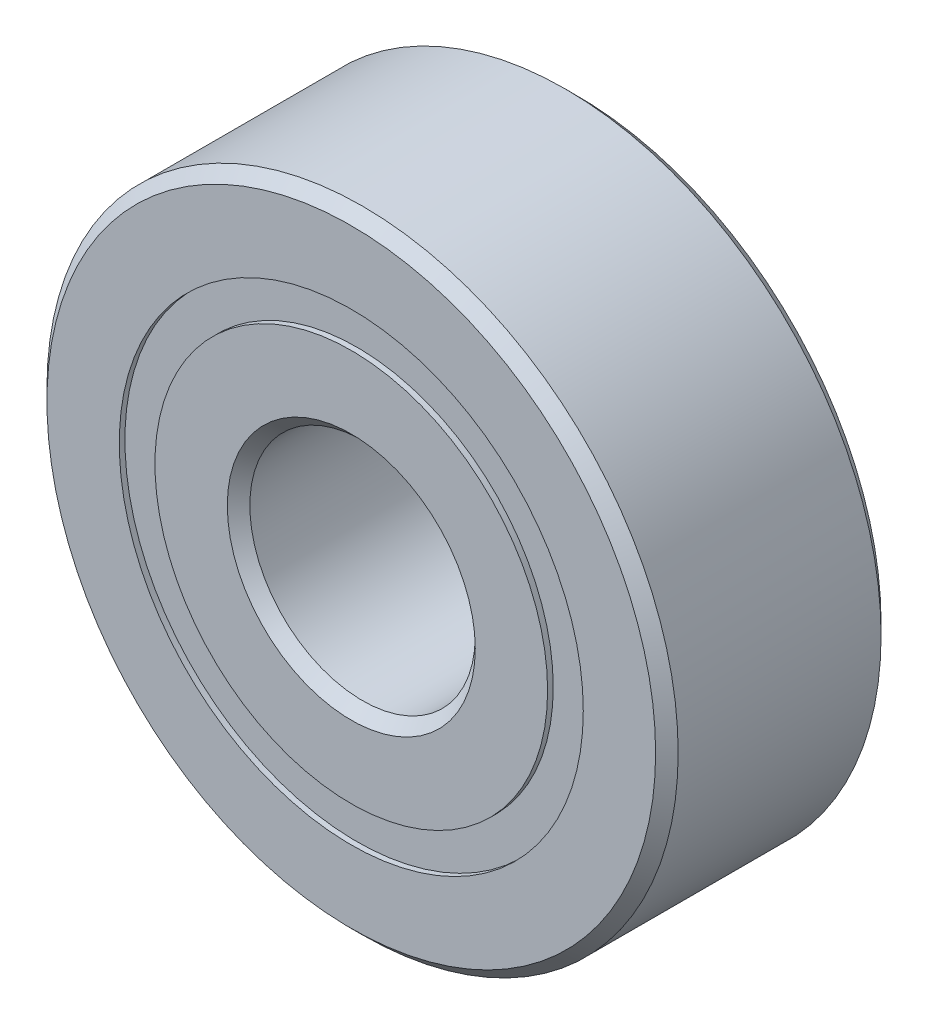
ISO-10303-21;
HEADER;
FILE_DESCRIPTION(('STEP AP214'),'2;1');
FILE_NAME('part.step','',(''),(''),'','','');
FILE_SCHEMA(('AUTOMOTIVE_DESIGN { 1 0 10303 214 1 1 1 1 }'));
ENDSEC;
DATA;
#1=APPLICATION_CONTEXT('core data for automotive mechanical design processes');
#2=APPLICATION_PROTOCOL_DEFINITION('international standard','automotive_design',2000,#1);
#3=PRODUCT_CONTEXT('',#1,'mechanical');
#4=PRODUCT('Part','Part','',(#3));
#5=PRODUCT_RELATED_PRODUCT_CATEGORY('part','',(#4));
#6=PRODUCT_DEFINITION_FORMATION('','',#4);
#7=PRODUCT_DEFINITION_CONTEXT('part definition',#1,'design');
#8=PRODUCT_DEFINITION('design','',#6,#7);
#9=PRODUCT_DEFINITION_SHAPE('','',#8);
#10=(LENGTH_UNIT() NAMED_UNIT(*) SI_UNIT(.MILLI.,.METRE.));
#11=(NAMED_UNIT(*) PLANE_ANGLE_UNIT() SI_UNIT($,.RADIAN.));
#12=(NAMED_UNIT(*) SI_UNIT($,.STERADIAN.) SOLID_ANGLE_UNIT());
#13=UNCERTAINTY_MEASURE_WITH_UNIT(LENGTH_MEASURE(1.E-05),#10,'distance_accuracy_value','');
#14=(GEOMETRIC_REPRESENTATION_CONTEXT(3) GLOBAL_UNCERTAINTY_ASSIGNED_CONTEXT((#13)) GLOBAL_UNIT_ASSIGNED_CONTEXT((#10,
#11,#12)) REPRESENTATION_CONTEXT('',''));
#15=CARTESIAN_POINT('',(0.,0.,0.));
#16=DIRECTION('',(0.,0.,1.));
#17=DIRECTION('',(1.,0.,0.));
#18=AXIS2_PLACEMENT_3D('',#15,#16,#17);
#19=CARTESIAN_POINT('',(0.,5.1456043956044,-2.375));
#20=DIRECTION('',(0.,0.,1.));
#21=DIRECTION('',(1.,0.,0.));
#22=AXIS2_PLACEMENT_3D('',#19,#20,#21);
#23=PLANE('',#22);
#24=CARTESIAN_POINT('',(0.,0.,-2.375));
#25=DIRECTION('',(0.,0.,1.));
#26=DIRECTION('',(1.,0.,0.));
#27=AXIS2_PLACEMENT_3D('',#24,#25,#26);
#28=CIRCLE('',#27,5.1456043956044);
#29=CARTESIAN_POINT('',(5.1456043956044,0.,-2.375));
#30=VERTEX_POINT('',#29);
#31=EDGE_CURVE('E59',#30,#30,#28,.T.);
#32=ORIENTED_EDGE('',*,*,#31,.F.);
#33=EDGE_LOOP('',(#32));
#34=FACE_BOUND('',#33,.T.);
#35=CARTESIAN_POINT('',(0.,0.,-2.375));
#36=DIRECTION('',(0.,0.,1.));
#37=DIRECTION('',(1.,0.,0.));
#38=AXIS2_PLACEMENT_3D('',#35,#36,#37);
#39=CIRCLE('',#38,4.3543956043956);
#40=CARTESIAN_POINT('',(4.3543956043956,0.,-2.375));
#41=VERTEX_POINT('',#40);
#42=EDGE_CURVE('E11',#41,#41,#39,.T.);
#43=ORIENTED_EDGE('',*,*,#42,.T.);
#44=EDGE_LOOP('',(#43));
#45=FACE_BOUND('',#44,.T.);
#46=ADVANCED_FACE('F45',(#34,#45),#23,.F.);
#47=CARTESIAN_POINT('',(0.,0.,2.5));
#48=DIRECTION('',(0.,0.,1.));
#49=DIRECTION('',(1.,0.,0.));
#50=AXIS2_PLACEMENT_3D('',#47,#48,#49);
#51=CYLINDRICAL_SURFACE('',#50,4.3543956043956);
#52=ORIENTED_EDGE('',*,*,#42,.F.);
#53=EDGE_LOOP('',(#52));
#54=FACE_BOUND('',#53,.T.);
#55=CARTESIAN_POINT('',(0.,0.,-1.17943661934675));
#56=DIRECTION('',(0.,0.,1.));
#57=DIRECTION('',(1.,0.,0.));
#58=AXIS2_PLACEMENT_3D('',#55,#56,#57);
#59=CIRCLE('',#58,4.3543956043956);
#60=CARTESIAN_POINT('',(4.3543956043956,0.,-1.17943661934675));
#61=VERTEX_POINT('',#60);
#62=EDGE_CURVE('E51',#61,#61,#59,.T.);
#63=ORIENTED_EDGE('',*,*,#62,.T.);
#64=EDGE_LOOP('',(#63));
#65=FACE_BOUND('',#64,.T.);
#66=ADVANCED_FACE('F68',(#54,#65),#51,.F.);
#67=CARTESIAN_POINT('',(0.,5.1456043956044,-1.17943661934675));
#68=DIRECTION('',(0.,0.,-1.));
#69=DIRECTION('',(-1.,0.,0.));
#70=AXIS2_PLACEMENT_3D('',#67,#68,#69);
#71=PLANE('',#70);
#72=ORIENTED_EDGE('',*,*,#62,.F.);
#73=EDGE_LOOP('',(#72));
#74=FACE_BOUND('',#73,.T.);
#75=CARTESIAN_POINT('',(0.,0.,-1.17943661934675));
#76=DIRECTION('',(0.,0.,1.));
#77=DIRECTION('',(1.,0.,0.));
#78=AXIS2_PLACEMENT_3D('',#75,#76,#77);
#79=CIRCLE('',#78,5.1456043956044);
#80=CARTESIAN_POINT('',(5.1456043956044,0.,-1.17943661934675));
#81=VERTEX_POINT('',#80);
#82=EDGE_CURVE('E55',#81,#81,#79,.T.);
#83=ORIENTED_EDGE('',*,*,#82,.T.);
#84=EDGE_LOOP('',(#83));
#85=FACE_BOUND('',#84,.T.);
#86=ADVANCED_FACE('F72',(#74,#85),#71,.F.);
#87=CARTESIAN_POINT('',(0.,0.,2.5));
#88=DIRECTION('',(0.,0.,1.));
#89=DIRECTION('',(1.,0.,0.));
#90=AXIS2_PLACEMENT_3D('',#87,#88,#89);
#91=CYLINDRICAL_SURFACE('',#90,5.1456043956044);
#92=ORIENTED_EDGE('',*,*,#82,.F.);
#93=EDGE_LOOP('',(#92));
#94=FACE_BOUND('',#93,.T.);
#95=ORIENTED_EDGE('',*,*,#31,.T.);
#96=EDGE_LOOP('',(#95));
#97=FACE_BOUND('',#96,.T.);
#98=ADVANCED_FACE('F65',(#94,#97),#91,.T.);
#99=CLOSED_SHELL('',(#46,#66,#86,#98));
#100=MANIFOLD_SOLID_BREP('B2',#99);
#101=CARTESIAN_POINT('',(0.,5.1456043956044,2.375));
#102=DIRECTION('',(0.,0.,-1.));
#103=DIRECTION('',(-1.,0.,0.));
#104=AXIS2_PLACEMENT_3D('',#101,#102,#103);
#105=PLANE('',#104);
#106=CARTESIAN_POINT('',(0.,0.,2.375));
#107=DIRECTION('',(0.,0.,1.));
#108=DIRECTION('',(1.,0.,0.));
#109=AXIS2_PLACEMENT_3D('',#106,#107,#108);
#110=CIRCLE('',#109,4.3543956043956);
#111=CARTESIAN_POINT('',(4.3543956043956,0.,2.375));
#112=VERTEX_POINT('',#111);
#113=EDGE_CURVE('E44',#112,#112,#110,.T.);
#114=ORIENTED_EDGE('',*,*,#113,.F.);
#115=EDGE_LOOP('',(#114));
#116=FACE_BOUND('',#115,.T.);
#117=CARTESIAN_POINT('',(0.,0.,2.375));
#118=DIRECTION('',(0.,0.,1.));
#119=DIRECTION('',(1.,0.,0.));
#120=AXIS2_PLACEMENT_3D('',#117,#118,#119);
#121=CIRCLE('',#120,5.1456043956044);
#122=CARTESIAN_POINT('',(5.1456043956044,0.,2.375));
#123=VERTEX_POINT('',#122);
#124=EDGE_CURVE('E134',#123,#123,#121,.T.);
#125=ORIENTED_EDGE('',*,*,#124,.T.);
#126=EDGE_LOOP('',(#125));
#127=FACE_BOUND('',#126,.T.);
#128=ADVANCED_FACE('F120',(#116,#127),#105,.F.);
#129=CARTESIAN_POINT('',(0.,0.,2.5));
#130=DIRECTION('',(0.,0.,1.));
#131=DIRECTION('',(1.,0.,0.));
#132=AXIS2_PLACEMENT_3D('',#129,#130,#131);
#133=CYLINDRICAL_SURFACE('',#132,4.3543956043956);
#134=CARTESIAN_POINT('',(0.,0.,1.17943661934675));
#135=DIRECTION('',(0.,0.,1.));
#136=DIRECTION('',(1.,0.,0.));
#137=AXIS2_PLACEMENT_3D('',#134,#135,#136);
#138=CIRCLE('',#137,4.3543956043956);
#139=CARTESIAN_POINT('',(4.3543956043956,0.,1.17943661934675));
#140=VERTEX_POINT('',#139);
#141=EDGE_CURVE('E126',#140,#140,#138,.T.);
#142=ORIENTED_EDGE('',*,*,#141,.F.);
#143=EDGE_LOOP('',(#142));
#144=FACE_BOUND('',#143,.T.);
#145=ORIENTED_EDGE('',*,*,#113,.T.);
#146=EDGE_LOOP('',(#145));
#147=FACE_BOUND('',#146,.T.);
#148=ADVANCED_FACE('F149',(#144,#147),#133,.F.);
#149=CARTESIAN_POINT('',(0.,5.1456043956044,1.17943661934675));
#150=DIRECTION('',(0.,0.,1.));
#151=DIRECTION('',(1.,0.,0.));
#152=AXIS2_PLACEMENT_3D('',#149,#150,#151);
#153=PLANE('',#152);
#154=CARTESIAN_POINT('',(0.,0.,1.17943661934675));
#155=DIRECTION('',(0.,0.,1.));
#156=DIRECTION('',(1.,0.,0.));
#157=AXIS2_PLACEMENT_3D('',#154,#155,#156);
#158=CIRCLE('',#157,5.1456043956044);
#159=CARTESIAN_POINT('',(5.1456043956044,0.,1.17943661934675));
#160=VERTEX_POINT('',#159);
#161=EDGE_CURVE('E130',#160,#160,#158,.T.);
#162=ORIENTED_EDGE('',*,*,#161,.F.);
#163=EDGE_LOOP('',(#162));
#164=FACE_BOUND('',#163,.T.);
#165=ORIENTED_EDGE('',*,*,#141,.T.);
#166=EDGE_LOOP('',(#165));
#167=FACE_BOUND('',#166,.T.);
#168=ADVANCED_FACE('F144',(#164,#167),#153,.F.);
#169=CARTESIAN_POINT('',(0.,0.,2.5));
#170=DIRECTION('',(0.,0.,1.));
#171=DIRECTION('',(1.,0.,0.));
#172=AXIS2_PLACEMENT_3D('',#169,#170,#171);
#173=CYLINDRICAL_SURFACE('',#172,5.1456043956044);
#174=ORIENTED_EDGE('',*,*,#124,.F.);
#175=EDGE_LOOP('',(#174));
#176=FACE_BOUND('',#175,.T.);
#177=ORIENTED_EDGE('',*,*,#161,.T.);
#178=EDGE_LOOP('',(#177));
#179=FACE_BOUND('',#178,.T.);
#180=ADVANCED_FACE('F141',(#176,#179),#173,.T.);
#181=CLOSED_SHELL('',(#128,#148,#168,#180));
#182=MANIFOLD_SOLID_BREP('B6',#181);
#183=CARTESIAN_POINT('',(-2.37499999999995,4.11362066797611,0.));
#184=DIRECTION('',(0.,0.,1.));
#185=DIRECTION('',(-0.499999999999989,0.866025403784445,0.));
#186=AXIS2_PLACEMENT_3D('',#183,#184,#185);
#187=SPHERICAL_SURFACE('',#186,1.17943661934675);
#188=CARTESIAN_POINT('',(-2.37499999999995,4.11362066797611,1.17943661934675));
#189=VERTEX_POINT('',#188);
#190=VERTEX_LOOP('',#189);
#191=FACE_BOUND('',#190,.T.);
#192=ADVANCED_FACE('F195',(#191),#187,.T.);
#193=CLOSED_SHELL('',(#192));
#194=MANIFOLD_SOLID_BREP('B39',#193);
#195=CARTESIAN_POINT('',(-4.11362066797606,2.37500000000005,0.));
#196=DIRECTION('',(0.,0.,1.));
#197=DIRECTION('',(-0.866025403784433,0.50000000000001,0.));
#198=AXIS2_PLACEMENT_3D('',#195,#196,#197);
#199=SPHERICAL_SURFACE('',#198,1.17943661934675);
#200=CARTESIAN_POINT('',(-4.11362066797606,2.37500000000005,1.17943661934675));
#201=VERTEX_POINT('',#200);
#202=VERTEX_LOOP('',#201);
#203=FACE_BOUND('',#202,.T.);
#204=ADVANCED_FACE('F217',(#203),#199,.T.);
#205=CLOSED_SHELL('',(#204));
#206=MANIFOLD_SOLID_BREP('B116',#205);
#207=CARTESIAN_POINT('',(-4.75,0.,0.));
#208=DIRECTION('',(0.,0.,1.));
#209=DIRECTION('',(-1.,0.,0.));
#210=AXIS2_PLACEMENT_3D('',#207,#208,#209);
#211=SPHERICAL_SURFACE('',#210,1.17943661934675);
#212=CARTESIAN_POINT('',(-4.75,0.,1.17943661934675));
#213=VERTEX_POINT('',#212);
#214=VERTEX_LOOP('',#213);
#215=FACE_BOUND('',#214,.T.);
#216=ADVANCED_FACE('F239',(#215),#211,.T.);
#217=CLOSED_SHELL('',(#216));
#218=MANIFOLD_SOLID_BREP('B191',#217);
#219=CARTESIAN_POINT('',(-4.1136206679761,-2.37499999999996,0.));
#220=DIRECTION('',(0.,0.,1.));
#221=DIRECTION('',(-0.866025403784443,-0.499999999999992,0.));
#222=AXIS2_PLACEMENT_3D('',#219,#220,#221);
#223=SPHERICAL_SURFACE('',#222,1.17943661934675);
#224=CARTESIAN_POINT('',(-4.1136206679761,-2.37499999999996,1.17943661934675));
#225=VERTEX_POINT('',#224);
#226=VERTEX_LOOP('',#225);
#227=FACE_BOUND('',#226,.T.);
#228=ADVANCED_FACE('F261',(#227),#223,.T.);
#229=CLOSED_SHELL('',(#228));
#230=MANIFOLD_SOLID_BREP('B213',#229);
#231=CARTESIAN_POINT('',(-2.37500000000003,-4.11362066797606,0.));
#232=DIRECTION('',(0.,0.,1.));
#233=DIRECTION('',(-0.500000000000007,-0.866025403784435,0.));
#234=AXIS2_PLACEMENT_3D('',#231,#232,#233);
#235=SPHERICAL_SURFACE('',#234,1.17943661934675);
#236=CARTESIAN_POINT('',(-2.37500000000003,-4.11362066797606,1.17943661934675));
#237=VERTEX_POINT('',#236);
#238=VERTEX_LOOP('',#237);
#239=FACE_BOUND('',#238,.T.);
#240=ADVANCED_FACE('F283',(#239),#235,.T.);
#241=CLOSED_SHELL('',(#240));
#242=MANIFOLD_SOLID_BREP('B235',#241);
#243=CARTESIAN_POINT('',(0.,-4.75,0.));
#244=DIRECTION('',(0.,0.,1.));
#245=DIRECTION('',(0.,-1.,0.));
#246=AXIS2_PLACEMENT_3D('',#243,#244,#245);
#247=SPHERICAL_SURFACE('',#246,1.17943661934675);
#248=CARTESIAN_POINT('',(0.,-4.75,1.17943661934675));
#249=VERTEX_POINT('',#248);
#250=VERTEX_LOOP('',#249);
#251=FACE_BOUND('',#250,.T.);
#252=ADVANCED_FACE('F305',(#251),#247,.T.);
#253=CLOSED_SHELL('',(#252));
#254=MANIFOLD_SOLID_BREP('B257',#253);
#255=CARTESIAN_POINT('',(2.37499999999998,-4.1136206679761,0.));
#256=DIRECTION('',(0.,0.,1.));
#257=DIRECTION('',(0.499999999999995,-0.866025403784442,0.));
#258=AXIS2_PLACEMENT_3D('',#255,#256,#257);
#259=SPHERICAL_SURFACE('',#258,1.17943661934675);
#260=CARTESIAN_POINT('',(2.37499999999998,-4.1136206679761,1.17943661934675));
#261=VERTEX_POINT('',#260);
#262=VERTEX_LOOP('',#261);
#263=FACE_BOUND('',#262,.T.);
#264=ADVANCED_FACE('F327',(#263),#259,.T.);
#265=CLOSED_SHELL('',(#264));
#266=MANIFOLD_SOLID_BREP('B279',#265);
#267=CARTESIAN_POINT('',(4.11362066797607,-2.37500000000002,0.));
#268=DIRECTION('',(0.,0.,1.));
#269=DIRECTION('',(0.866025403784436,-0.500000000000004,0.));
#270=AXIS2_PLACEMENT_3D('',#267,#268,#269);
#271=SPHERICAL_SURFACE('',#270,1.17943661934675);
#272=CARTESIAN_POINT('',(4.11362066797607,-2.37500000000002,1.17943661934675));
#273=VERTEX_POINT('',#272);
#274=VERTEX_LOOP('',#273);
#275=FACE_BOUND('',#274,.T.);
#276=ADVANCED_FACE('F349',(#275),#271,.T.);
#277=CLOSED_SHELL('',(#276));
#278=MANIFOLD_SOLID_BREP('B301',#277);
#279=CARTESIAN_POINT('',(4.75,0.,0.));
#280=DIRECTION('',(0.,0.,1.));
#281=DIRECTION('',(1.,0.,0.));
#282=AXIS2_PLACEMENT_3D('',#279,#280,#281);
#283=SPHERICAL_SURFACE('',#282,1.17943661934675);
#284=CARTESIAN_POINT('',(4.75,0.,1.17943661934675));
#285=VERTEX_POINT('',#284);
#286=VERTEX_LOOP('',#285);
#287=FACE_BOUND('',#286,.T.);
#288=ADVANCED_FACE('F371',(#287),#283,.T.);
#289=CLOSED_SHELL('',(#288));
#290=MANIFOLD_SOLID_BREP('B323',#289);
#291=CARTESIAN_POINT('',(4.11362066797609,2.37499999999999,0.));
#292=DIRECTION('',(0.,0.,1.));
#293=DIRECTION('',(0.86602540378444,0.499999999999998,0.));
#294=AXIS2_PLACEMENT_3D('',#291,#292,#293);
#295=SPHERICAL_SURFACE('',#294,1.17943661934675);
#296=CARTESIAN_POINT('',(4.11362066797609,2.37499999999999,1.17943661934675));
#297=VERTEX_POINT('',#296);
#298=VERTEX_LOOP('',#297);
#299=FACE_BOUND('',#298,.T.);
#300=ADVANCED_FACE('F393',(#299),#295,.T.);
#301=CLOSED_SHELL('',(#300));
#302=MANIFOLD_SOLID_BREP('B345',#301);
#303=CARTESIAN_POINT('',(2.375,4.11362066797608,0.));
#304=DIRECTION('',(0.,0.,1.));
#305=DIRECTION('',(0.500000000000001,0.866025403784438,0.));
#306=AXIS2_PLACEMENT_3D('',#303,#304,#305);
#307=SPHERICAL_SURFACE('',#306,1.17943661934675);
#308=CARTESIAN_POINT('',(2.375,4.11362066797608,1.17943661934675));
#309=VERTEX_POINT('',#308);
#310=VERTEX_LOOP('',#309);
#311=FACE_BOUND('',#310,.T.);
#312=ADVANCED_FACE('F415',(#311),#307,.T.);
#313=CLOSED_SHELL('',(#312));
#314=MANIFOLD_SOLID_BREP('B367',#313);
#315=CARTESIAN_POINT('',(0.,4.75,0.));
#316=DIRECTION('',(0.,0.,1.));
#317=DIRECTION('',(0.,1.,0.));
#318=AXIS2_PLACEMENT_3D('',#315,#316,#317);
#319=SPHERICAL_SURFACE('',#318,1.17943661934675);
#320=CARTESIAN_POINT('',(0.,4.75,1.17943661934675));
#321=VERTEX_POINT('',#320);
#322=VERTEX_LOOP('',#321);
#323=FACE_BOUND('',#322,.T.);
#324=ADVANCED_FACE('F439',(#323),#319,.T.);
#325=CLOSED_SHELL('',(#324));
#326=MANIFOLD_SOLID_BREP('B389',#325);
#327=CARTESIAN_POINT('',(0.,4.3543956043956,2.5));
#328=DIRECTION('',(0.,0.,-1.));
#329=DIRECTION('',(-1.,0.,0.));
#330=AXIS2_PLACEMENT_3D('',#327,#328,#329);
#331=PLANE('',#330);
#332=CARTESIAN_POINT('',(0.,0.,2.5));
#333=DIRECTION('',(0.,0.,1.));
#334=DIRECTION('',(1.,0.,0.));
#335=AXIS2_PLACEMENT_3D('',#332,#333,#334);
#336=CIRCLE('',#335,2.75);
#337=CARTESIAN_POINT('',(2.75,0.,2.5));
#338=VERTEX_POINT('',#337);
#339=EDGE_CURVE('E488',#338,#338,#336,.T.);
#340=ORIENTED_EDGE('',*,*,#339,.F.);
#341=EDGE_LOOP('',(#340));
#342=FACE_BOUND('',#341,.T.);
#343=CARTESIAN_POINT('',(0.,0.,2.5));
#344=DIRECTION('',(0.,0.,1.));
#345=DIRECTION('',(1.,0.,0.));
#346=AXIS2_PLACEMENT_3D('',#343,#344,#345);
#347=CIRCLE('',#346,4.3543956043956);
#348=CARTESIAN_POINT('',(4.3543956043956,0.,2.5));
#349=VERTEX_POINT('',#348);
#350=EDGE_CURVE('E438',#349,#349,#347,.T.);
#351=ORIENTED_EDGE('',*,*,#350,.T.);
#352=EDGE_LOOP('',(#351));
#353=FACE_BOUND('',#352,.T.);
#354=ADVANCED_FACE('F460',(#342,#353),#331,.F.);
#355=CARTESIAN_POINT('',(0.,0.,2.5));
#356=DIRECTION('',(0.,0.,1.));
#357=DIRECTION('',(1.,0.,0.));
#358=AXIS2_PLACEMENT_3D('',#355,#356,#357);
#359=CYLINDRICAL_SURFACE('',#358,4.3543956043956);
#360=ORIENTED_EDGE('',*,*,#350,.F.);
#361=EDGE_LOOP('',(#360));
#362=FACE_BOUND('',#361,.T.);
#363=CARTESIAN_POINT('',(0.,0.,1.11111111111111));
#364=DIRECTION('',(0.,0.,1.));
#365=DIRECTION('',(1.,0.,0.));
#366=AXIS2_PLACEMENT_3D('',#363,#364,#365);
#367=CIRCLE('',#366,4.3543956043956);
#368=CARTESIAN_POINT('',(4.3543956043956,0.,1.11111111111111));
#369=VERTEX_POINT('',#368);
#370=EDGE_CURVE('E466',#369,#369,#367,.T.);
#371=ORIENTED_EDGE('',*,*,#370,.T.);
#372=EDGE_LOOP('',(#371));
#373=FACE_BOUND('',#372,.T.);
#374=ADVANCED_FACE('F495',(#362,#373),#359,.T.);
#375=CARTESIAN_POINT('',(0.,0.,0.));
#376=DIRECTION('',(0.,0.,1.));
#377=DIRECTION('',(1.,0.,0.));
#378=AXIS2_PLACEMENT_3D('',#375,#376,#377);
#379=TOROIDAL_SURFACE('',#378,4.75,1.17943661934675);
#380=ORIENTED_EDGE('',*,*,#370,.F.);
#381=EDGE_LOOP('',(#380));
#382=FACE_BOUND('',#381,.T.);
#383=CARTESIAN_POINT('',(0.,0.,-1.11111111111111));
#384=DIRECTION('',(0.,0.,1.));
#385=DIRECTION('',(1.,0.,0.));
#386=AXIS2_PLACEMENT_3D('',#383,#384,#385);
#387=CIRCLE('',#386,4.3543956043956);
#388=CARTESIAN_POINT('',(4.3543956043956,0.,-1.11111111111111));
#389=VERTEX_POINT('',#388);
#390=EDGE_CURVE('E470',#389,#389,#387,.T.);
#391=ORIENTED_EDGE('',*,*,#390,.T.);
#392=EDGE_LOOP('',(#391));
#393=FACE_BOUND('',#392,.T.);
#394=ADVANCED_FACE('F499',(#382,#393),#379,.F.);
#395=CARTESIAN_POINT('',(0.,0.,2.5));
#396=DIRECTION('',(0.,0.,1.));
#397=DIRECTION('',(1.,0.,0.));
#398=AXIS2_PLACEMENT_3D('',#395,#396,#397);
#399=CYLINDRICAL_SURFACE('',#398,4.3543956043956);
#400=ORIENTED_EDGE('',*,*,#390,.F.);
#401=EDGE_LOOP('',(#400));
#402=FACE_BOUND('',#401,.T.);
#403=CARTESIAN_POINT('',(0.,0.,-2.5));
#404=DIRECTION('',(0.,0.,1.));
#405=DIRECTION('',(1.,0.,0.));
#406=AXIS2_PLACEMENT_3D('',#403,#404,#405);
#407=CIRCLE('',#406,4.3543956043956);
#408=CARTESIAN_POINT('',(4.3543956043956,0.,-2.5));
#409=VERTEX_POINT('',#408);
#410=EDGE_CURVE('E474',#409,#409,#407,.T.);
#411=ORIENTED_EDGE('',*,*,#410,.T.);
#412=EDGE_LOOP('',(#411));
#413=FACE_BOUND('',#412,.T.);
#414=ADVANCED_FACE('F504',(#402,#413),#399,.T.);
#415=CARTESIAN_POINT('',(0.,2.75,-2.5));
#416=DIRECTION('',(0.,0.,1.));
#417=DIRECTION('',(1.,0.,0.));
#418=AXIS2_PLACEMENT_3D('',#415,#416,#417);
#419=PLANE('',#418);
#420=ORIENTED_EDGE('',*,*,#410,.F.);
#421=EDGE_LOOP('',(#420));
#422=FACE_BOUND('',#421,.T.);
#423=CARTESIAN_POINT('',(0.,0.,-2.5));
#424=DIRECTION('',(0.,0.,1.));
#425=DIRECTION('',(1.,0.,0.));
#426=AXIS2_PLACEMENT_3D('',#423,#424,#425);
#427=CIRCLE('',#426,2.75);
#428=CARTESIAN_POINT('',(2.75,0.,-2.5));
#429=VERTEX_POINT('',#428);
#430=EDGE_CURVE('E479',#429,#429,#427,.T.);
#431=ORIENTED_EDGE('',*,*,#430,.T.);
#432=EDGE_LOOP('',(#431));
#433=FACE_BOUND('',#432,.T.);
#434=ADVANCED_FACE('F510',(#422,#433),#419,.F.);
#435=CARTESIAN_POINT('',(0.,0.,-2.25));
#436=DIRECTION('',(0.,0.,-1.));
#437=DIRECTION('',(-1.,0.,0.));
#438=AXIS2_PLACEMENT_3D('',#435,#436,#437);
#439=CONICAL_SURFACE('',#438,2.5,0.785398163397443);
#440=ORIENTED_EDGE('',*,*,#430,.F.);
#441=EDGE_LOOP('',(#440));
#442=FACE_BOUND('',#441,.T.);
#443=CARTESIAN_POINT('',(0.,0.,-2.25));
#444=DIRECTION('',(0.,0.,1.));
#445=DIRECTION('',(1.,0.,0.));
#446=AXIS2_PLACEMENT_3D('',#443,#444,#445);
#447=CIRCLE('',#446,2.5);
#448=CARTESIAN_POINT('',(2.5,0.,-2.25));
#449=VERTEX_POINT('',#448);
#450=EDGE_CURVE('E482',#449,#449,#447,.T.);
#451=ORIENTED_EDGE('',*,*,#450,.T.);
#452=EDGE_LOOP('',(#451));
#453=FACE_BOUND('',#452,.T.);
#454=ADVANCED_FACE('F514',(#442,#453),#439,.F.);
#455=CARTESIAN_POINT('',(0.,0.,2.5));
#456=DIRECTION('',(0.,0.,1.));
#457=DIRECTION('',(1.,0.,0.));
#458=AXIS2_PLACEMENT_3D('',#455,#456,#457);
#459=CYLINDRICAL_SURFACE('',#458,2.5);
#460=ORIENTED_EDGE('',*,*,#450,.F.);
#461=EDGE_LOOP('',(#460));
#462=FACE_BOUND('',#461,.T.);
#463=CARTESIAN_POINT('',(0.,0.,2.25));
#464=DIRECTION('',(0.,0.,1.));
#465=DIRECTION('',(1.,0.,0.));
#466=AXIS2_PLACEMENT_3D('',#463,#464,#465);
#467=CIRCLE('',#466,2.5);
#468=CARTESIAN_POINT('',(2.5,0.,2.25));
#469=VERTEX_POINT('',#468);
#470=EDGE_CURVE('E485',#469,#469,#467,.T.);
#471=ORIENTED_EDGE('',*,*,#470,.T.);
#472=EDGE_LOOP('',(#471));
#473=FACE_BOUND('',#472,.T.);
#474=ADVANCED_FACE('F518',(#462,#473),#459,.F.);
#475=CARTESIAN_POINT('',(0.,0.,2.5));
#476=DIRECTION('',(0.,0.,1.));
#477=DIRECTION('',(1.,0.,0.));
#478=AXIS2_PLACEMENT_3D('',#475,#476,#477);
#479=CONICAL_SURFACE('',#478,2.75,0.785398163397453);
#480=ORIENTED_EDGE('',*,*,#470,.F.);
#481=EDGE_LOOP('',(#480));
#482=FACE_BOUND('',#481,.T.);
#483=ORIENTED_EDGE('',*,*,#339,.T.);
#484=EDGE_LOOP('',(#483));
#485=FACE_BOUND('',#484,.T.);
#486=ADVANCED_FACE('F492',(#482,#485),#479,.F.);
#487=CLOSED_SHELL('',(#354,#374,#394,#414,#434,#454,#474,#486));
#488=MANIFOLD_SOLID_BREP('B411',#487);
#489=CARTESIAN_POINT('',(0.,0.,2.25));
#490=DIRECTION('',(0.,0.,-1.));
#491=DIRECTION('',(-1.,0.,0.));
#492=AXIS2_PLACEMENT_3D('',#489,#490,#491);
#493=CONICAL_SURFACE('',#492,7.,0.785398163397449);
#494=CARTESIAN_POINT('',(0.,0.,2.5));
#495=DIRECTION('',(0.,0.,1.));
#496=DIRECTION('',(1.,0.,0.));
#497=AXIS2_PLACEMENT_3D('',#494,#495,#496);
#498=CIRCLE('',#497,6.75);
#499=CARTESIAN_POINT('',(6.75,0.,2.5));
#500=VERTEX_POINT('',#499);
#501=EDGE_CURVE('E625',#500,#500,#498,.T.);
#502=ORIENTED_EDGE('',*,*,#501,.F.);
#503=EDGE_LOOP('',(#502));
#504=FACE_BOUND('',#503,.T.);
#505=CARTESIAN_POINT('',(0.,0.,2.25));
#506=DIRECTION('',(0.,0.,1.));
#507=DIRECTION('',(1.,0.,0.));
#508=AXIS2_PLACEMENT_3D('',#505,#506,#507);
#509=CIRCLE('',#508,7.);
#510=CARTESIAN_POINT('',(7.,0.,2.25));
#511=VERTEX_POINT('',#510);
#512=EDGE_CURVE('E459',#511,#511,#509,.T.);
#513=ORIENTED_EDGE('',*,*,#512,.T.);
#514=EDGE_LOOP('',(#513));
#515=FACE_BOUND('',#514,.T.);
#516=ADVANCED_FACE('F597',(#504,#515),#493,.T.);
#517=CARTESIAN_POINT('',(0.,0.,2.5));
#518=DIRECTION('',(0.,0.,1.));
#519=DIRECTION('',(1.,0.,0.));
#520=AXIS2_PLACEMENT_3D('',#517,#518,#519);
#521=CYLINDRICAL_SURFACE('',#520,7.);
#522=ORIENTED_EDGE('',*,*,#512,.F.);
#523=EDGE_LOOP('',(#522));
#524=FACE_BOUND('',#523,.T.);
#525=CARTESIAN_POINT('',(0.,0.,-2.25));
#526=DIRECTION('',(0.,0.,1.));
#527=DIRECTION('',(1.,0.,0.));
#528=AXIS2_PLACEMENT_3D('',#525,#526,#527);
#529=CIRCLE('',#528,7.);
#530=CARTESIAN_POINT('',(7.,0.,-2.25));
#531=VERTEX_POINT('',#530);
#532=EDGE_CURVE('E603',#531,#531,#529,.T.);
#533=ORIENTED_EDGE('',*,*,#532,.T.);
#534=EDGE_LOOP('',(#533));
#535=FACE_BOUND('',#534,.T.);
#536=ADVANCED_FACE('F632',(#524,#535),#521,.T.);
#537=CARTESIAN_POINT('',(0.,0.,-2.5));
#538=DIRECTION('',(0.,0.,1.));
#539=DIRECTION('',(1.,0.,0.));
#540=AXIS2_PLACEMENT_3D('',#537,#538,#539);
#541=CONICAL_SURFACE('',#540,6.75,0.785398163397447);
#542=ORIENTED_EDGE('',*,*,#532,.F.);
#543=EDGE_LOOP('',(#542));
#544=FACE_BOUND('',#543,.T.);
#545=CARTESIAN_POINT('',(0.,0.,-2.5));
#546=DIRECTION('',(0.,0.,1.));
#547=DIRECTION('',(1.,0.,0.));
#548=AXIS2_PLACEMENT_3D('',#545,#546,#547);
#549=CIRCLE('',#548,6.75);
#550=CARTESIAN_POINT('',(6.75,0.,-2.5));
#551=VERTEX_POINT('',#550);
#552=EDGE_CURVE('E607',#551,#551,#549,.T.);
#553=ORIENTED_EDGE('',*,*,#552,.T.);
#554=EDGE_LOOP('',(#553));
#555=FACE_BOUND('',#554,.T.);
#556=ADVANCED_FACE('F636',(#544,#555),#541,.T.);
#557=CARTESIAN_POINT('',(0.,6.75,-2.5));
#558=DIRECTION('',(0.,0.,1.));
#559=DIRECTION('',(1.,0.,0.));
#560=AXIS2_PLACEMENT_3D('',#557,#558,#559);
#561=PLANE('',#560);
#562=ORIENTED_EDGE('',*,*,#552,.F.);
#563=EDGE_LOOP('',(#562));
#564=FACE_BOUND('',#563,.T.);
#565=CARTESIAN_POINT('',(0.,0.,-2.5));
#566=DIRECTION('',(0.,0.,1.));
#567=DIRECTION('',(1.,0.,0.));
#568=AXIS2_PLACEMENT_3D('',#565,#566,#567);
#569=CIRCLE('',#568,5.1456043956044);
#570=CARTESIAN_POINT('',(5.1456043956044,0.,-2.5));
#571=VERTEX_POINT('',#570);
#572=EDGE_CURVE('E611',#571,#571,#569,.T.);
#573=ORIENTED_EDGE('',*,*,#572,.T.);
#574=EDGE_LOOP('',(#573));
#575=FACE_BOUND('',#574,.T.);
#576=ADVANCED_FACE('F641',(#564,#575),#561,.F.);
#577=CARTESIAN_POINT('',(0.,0.,2.5));
#578=DIRECTION('',(0.,0.,1.));
#579=DIRECTION('',(1.,0.,0.));
#580=AXIS2_PLACEMENT_3D('',#577,#578,#579);
#581=CYLINDRICAL_SURFACE('',#580,5.1456043956044);
#582=ORIENTED_EDGE('',*,*,#572,.F.);
#583=EDGE_LOOP('',(#582));
#584=FACE_BOUND('',#583,.T.);
#585=CARTESIAN_POINT('',(0.,0.,-1.11111111111111));
#586=DIRECTION('',(0.,0.,1.));
#587=DIRECTION('',(1.,0.,0.));
#588=AXIS2_PLACEMENT_3D('',#585,#586,#587);
#589=CIRCLE('',#588,5.1456043956044);
#590=CARTESIAN_POINT('',(5.1456043956044,0.,-1.11111111111111));
#591=VERTEX_POINT('',#590);
#592=EDGE_CURVE('E616',#591,#591,#589,.T.);
#593=ORIENTED_EDGE('',*,*,#592,.T.);
#594=EDGE_LOOP('',(#593));
#595=FACE_BOUND('',#594,.T.);
#596=ADVANCED_FACE('F647',(#584,#595),#581,.F.);
#597=CARTESIAN_POINT('',(0.,0.,0.));
#598=DIRECTION('',(0.,0.,1.));
#599=DIRECTION('',(1.,0.,0.));
#600=AXIS2_PLACEMENT_3D('',#597,#598,#599);
#601=TOROIDAL_SURFACE('',#600,4.75,1.17943661934675);
#602=ORIENTED_EDGE('',*,*,#592,.F.);
#603=EDGE_LOOP('',(#602));
#604=FACE_BOUND('',#603,.T.);
#605=CARTESIAN_POINT('',(0.,0.,1.11111111111111));
#606=DIRECTION('',(0.,0.,1.));
#607=DIRECTION('',(1.,0.,0.));
#608=AXIS2_PLACEMENT_3D('',#605,#606,#607);
#609=CIRCLE('',#608,5.1456043956044);
#610=CARTESIAN_POINT('',(5.1456043956044,0.,1.11111111111111));
#611=VERTEX_POINT('',#610);
#612=EDGE_CURVE('E619',#611,#611,#609,.T.);
#613=ORIENTED_EDGE('',*,*,#612,.T.);
#614=EDGE_LOOP('',(#613));
#615=FACE_BOUND('',#614,.T.);
#616=ADVANCED_FACE('F651',(#604,#615),#601,.F.);
#617=CARTESIAN_POINT('',(0.,0.,2.5));
#618=DIRECTION('',(0.,0.,1.));
#619=DIRECTION('',(1.,0.,0.));
#620=AXIS2_PLACEMENT_3D('',#617,#618,#619);
#621=CYLINDRICAL_SURFACE('',#620,5.1456043956044);
#622=ORIENTED_EDGE('',*,*,#612,.F.);
#623=EDGE_LOOP('',(#622));
#624=FACE_BOUND('',#623,.T.);
#625=CARTESIAN_POINT('',(0.,0.,2.5));
#626=DIRECTION('',(0.,0.,1.));
#627=DIRECTION('',(1.,0.,0.));
#628=AXIS2_PLACEMENT_3D('',#625,#626,#627);
#629=CIRCLE('',#628,5.1456043956044);
#630=CARTESIAN_POINT('',(5.1456043956044,0.,2.5));
#631=VERTEX_POINT('',#630);
#632=EDGE_CURVE('E622',#631,#631,#629,.T.);
#633=ORIENTED_EDGE('',*,*,#632,.T.);
#634=EDGE_LOOP('',(#633));
#635=FACE_BOUND('',#634,.T.);
#636=ADVANCED_FACE('F655',(#624,#635),#621,.F.);
#637=CARTESIAN_POINT('',(0.,6.75,2.5));
#638=DIRECTION('',(0.,0.,-1.));
#639=DIRECTION('',(-1.,0.,0.));
#640=AXIS2_PLACEMENT_3D('',#637,#638,#639);
#641=PLANE('',#640);
#642=ORIENTED_EDGE('',*,*,#632,.F.);
#643=EDGE_LOOP('',(#642));
#644=FACE_BOUND('',#643,.T.);
#645=ORIENTED_EDGE('',*,*,#501,.T.);
#646=EDGE_LOOP('',(#645));
#647=FACE_BOUND('',#646,.T.);
#648=ADVANCED_FACE('F629',(#644,#647),#641,.F.);
#649=CLOSED_SHELL('',(#516,#536,#556,#576,#596,#616,#636,#648));
#650=MANIFOLD_SOLID_BREP('B433',#649);
#651=ADVANCED_BREP_SHAPE_REPRESENTATION('',(#18,#100,#182,#194,#206,#218,#230,#242,#254,#266,
#278,#290,#302,#314,#326,#488,#650),#14);
#652=SHAPE_DEFINITION_REPRESENTATION(#9,#651);
ENDSEC;
END-ISO-10303-21;
